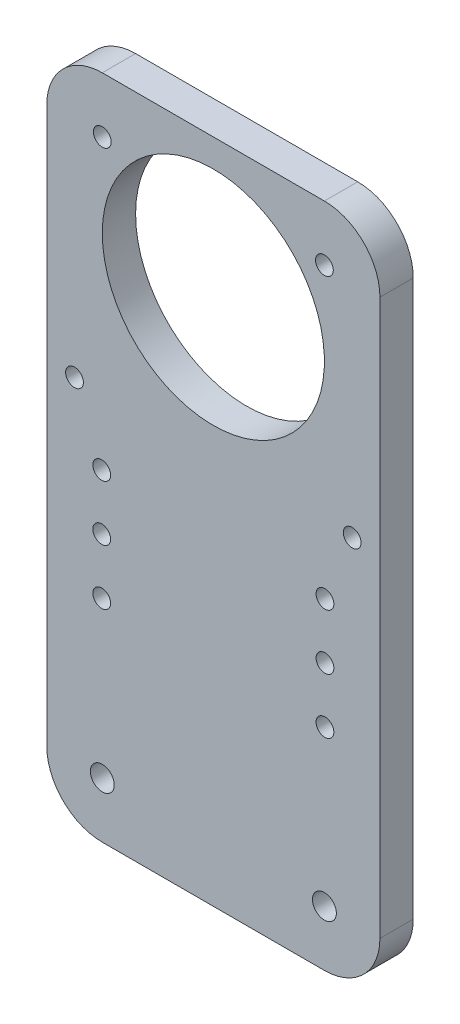
ISO-10303-21;
HEADER;
FILE_DESCRIPTION(('STEP AP214'),'2;1');
FILE_NAME('part.step','',(''),(''),'','','');
FILE_SCHEMA(('AUTOMOTIVE_DESIGN { 1 0 10303 214 1 1 1 1 }'));
ENDSEC;
DATA;
#1=APPLICATION_CONTEXT('core data for automotive mechanical design processes');
#2=APPLICATION_PROTOCOL_DEFINITION('international standard','automotive_design',2000,#1);
#3=PRODUCT_CONTEXT('',#1,'mechanical');
#4=PRODUCT('Part','Part','',(#3));
#5=PRODUCT_RELATED_PRODUCT_CATEGORY('part','',(#4));
#6=PRODUCT_DEFINITION_FORMATION('','',#4);
#7=PRODUCT_DEFINITION_CONTEXT('part definition',#1,'design');
#8=PRODUCT_DEFINITION('design','',#6,#7);
#9=PRODUCT_DEFINITION_SHAPE('','',#8);
#10=(LENGTH_UNIT() NAMED_UNIT(*) SI_UNIT(.MILLI.,.METRE.));
#11=(NAMED_UNIT(*) PLANE_ANGLE_UNIT() SI_UNIT($,.RADIAN.));
#12=(NAMED_UNIT(*) SI_UNIT($,.STERADIAN.) SOLID_ANGLE_UNIT());
#13=UNCERTAINTY_MEASURE_WITH_UNIT(LENGTH_MEASURE(1.E-05),#10,'distance_accuracy_value','');
#14=(GEOMETRIC_REPRESENTATION_CONTEXT(3) GLOBAL_UNCERTAINTY_ASSIGNED_CONTEXT((#13)) GLOBAL_UNIT_ASSIGNED_CONTEXT((#10,
#11,#12)) REPRESENTATION_CONTEXT('',''));
#15=CARTESIAN_POINT('',(0.,0.,0.));
#16=DIRECTION('',(0.,0.,1.));
#17=DIRECTION('',(1.,0.,0.));
#18=AXIS2_PLACEMENT_3D('',#15,#16,#17);
#19=CARTESIAN_POINT('',(0.,0.,6.));
#20=DIRECTION('',(0.,0.,1.));
#21=DIRECTION('',(1.,0.,0.));
#22=AXIS2_PLACEMENT_3D('',#19,#20,#21);
#23=PLANE('',#22);
#24=CARTESIAN_POINT('',(-20.,50.0000000000002,6.));
#25=DIRECTION('',(0.,0.,1.));
#26=DIRECTION('',(1.,0.,0.));
#27=AXIS2_PLACEMENT_3D('',#24,#25,#26);
#28=CIRCLE('',#27,1.6);
#29=CARTESIAN_POINT('',(-18.4,50.0000000000002,6.));
#30=VERTEX_POINT('',#29);
#31=EDGE_CURVE('E297',#30,#30,#28,.F.);
#32=ORIENTED_EDGE('',*,*,#31,.T.);
#33=EDGE_LOOP('',(#32));
#34=FACE_BOUND('',#33,.T.);
#35=CARTESIAN_POINT('',(20.,50.,6.));
#36=DIRECTION('',(0.,0.,1.));
#37=DIRECTION('',(1.,0.,0.));
#38=AXIS2_PLACEMENT_3D('',#35,#36,#37);
#39=CIRCLE('',#38,1.6);
#40=CARTESIAN_POINT('',(21.6,50.,6.));
#41=VERTEX_POINT('',#40);
#42=EDGE_CURVE('E301',#41,#41,#39,.T.);
#43=ORIENTED_EDGE('',*,*,#42,.F.);
#44=EDGE_LOOP('',(#43));
#45=FACE_BOUND('',#44,.T.);
#46=CARTESIAN_POINT('',(0.,35.,6.));
#47=DIRECTION('',(0.,0.,-1.));
#48=DIRECTION('',(-1.,0.,0.));
#49=AXIS2_PLACEMENT_3D('',#46,#47,#48);
#50=CIRCLE('',#49,20.);
#51=CARTESIAN_POINT('',(-20.,35.,6.));
#52=VERTEX_POINT('',#51);
#53=EDGE_CURVE('E247',#52,#52,#50,.T.);
#54=ORIENTED_EDGE('',*,*,#53,.T.);
#55=EDGE_LOOP('',(#54));
#56=FACE_BOUND('',#55,.T.);
#57=CARTESIAN_POINT('',(20.1000000000003,-11.9999999999998,6.));
#58=DIRECTION('',(0.,0.,1.));
#59=DIRECTION('',(1.,0.,0.));
#60=AXIS2_PLACEMENT_3D('',#57,#58,#59);
#61=CIRCLE('',#60,1.6);
#62=CARTESIAN_POINT('',(21.7000000000003,-11.9999999999998,6.));
#63=VERTEX_POINT('',#62);
#64=EDGE_CURVE('E271',#63,#63,#61,.F.);
#65=ORIENTED_EDGE('',*,*,#64,.T.);
#66=EDGE_LOOP('',(#65));
#67=FACE_BOUND('',#66,.T.);
#68=CARTESIAN_POINT('',(20.1000000000002,-1.99999999999975,6.));
#69=DIRECTION('',(0.,0.,1.));
#70=DIRECTION('',(1.,0.,0.));
#71=AXIS2_PLACEMENT_3D('',#68,#69,#70);
#72=CIRCLE('',#71,1.6);
#73=CARTESIAN_POINT('',(21.7000000000002,-1.99999999999975,6.));
#74=VERTEX_POINT('',#73);
#75=EDGE_CURVE('E238',#74,#74,#72,.F.);
#76=ORIENTED_EDGE('',*,*,#75,.T.);
#77=EDGE_LOOP('',(#76));
#78=FACE_BOUND('',#77,.T.);
#79=CARTESIAN_POINT('',(20.1000000000004,-21.9999999999998,6.));
#80=DIRECTION('',(0.,0.,1.));
#81=DIRECTION('',(1.,0.,0.));
#82=AXIS2_PLACEMENT_3D('',#79,#80,#81);
#83=CIRCLE('',#82,1.6);
#84=CARTESIAN_POINT('',(21.7000000000004,-21.9999999999998,6.));
#85=VERTEX_POINT('',#84);
#86=EDGE_CURVE('E234',#85,#85,#83,.F.);
#87=ORIENTED_EDGE('',*,*,#86,.T.);
#88=EDGE_LOOP('',(#87));
#89=FACE_BOUND('',#88,.T.);
#90=CARTESIAN_POINT('',(20.,-50.,6.));
#91=DIRECTION('',(0.,0.,1.));
#92=DIRECTION('',(1.,0.,0.));
#93=AXIS2_PLACEMENT_3D('',#90,#91,#92);
#94=CIRCLE('',#93,2.15);
#95=CARTESIAN_POINT('',(22.15,-50.,6.));
#96=VERTEX_POINT('',#95);
#97=EDGE_CURVE('E166',#96,#96,#94,.T.);
#98=ORIENTED_EDGE('',*,*,#97,.F.);
#99=EDGE_LOOP('',(#98));
#100=FACE_BOUND('',#99,.T.);
#101=DIRECTION('',(1.,0.,0.));
#102=VECTOR('',#101,1.);
#103=CARTESIAN_POINT('',(0.,-60.,6.));
#104=LINE('',#103,#102);
#105=CARTESIAN_POINT('',(-20.,-60.,6.));
#106=VERTEX_POINT('',#105);
#107=CARTESIAN_POINT('',(20.,-60.,6.));
#108=VERTEX_POINT('',#107);
#109=EDGE_CURVE('E221',#106,#108,#104,.T.);
#110=ORIENTED_EDGE('',*,*,#109,.T.);
#111=CARTESIAN_POINT('',(20.,-50.,6.));
#112=DIRECTION('',(0.,0.,1.));
#113=DIRECTION('',(1.,0.,0.));
#114=AXIS2_PLACEMENT_3D('',#111,#112,#113);
#115=CIRCLE('',#114,10.);
#116=CARTESIAN_POINT('',(30.,-50.,6.));
#117=VERTEX_POINT('',#116);
#118=EDGE_CURVE('E189',#108,#117,#115,.T.);
#119=ORIENTED_EDGE('',*,*,#118,.T.);
#120=DIRECTION('',(0.,1.,0.));
#121=VECTOR('',#120,1.);
#122=CARTESIAN_POINT('',(30.,0.,6.));
#123=LINE('',#122,#121);
#124=CARTESIAN_POINT('',(30.,50.,6.));
#125=VERTEX_POINT('',#124);
#126=EDGE_CURVE('E134',#117,#125,#123,.T.);
#127=ORIENTED_EDGE('',*,*,#126,.T.);
#128=CARTESIAN_POINT('',(20.,50.,6.));
#129=DIRECTION('',(0.,0.,1.));
#130=DIRECTION('',(1.,0.,0.));
#131=AXIS2_PLACEMENT_3D('',#128,#129,#130);
#132=CIRCLE('',#131,10.);
#133=CARTESIAN_POINT('',(20.,60.,6.));
#134=VERTEX_POINT('',#133);
#135=EDGE_CURVE('E183',#125,#134,#132,.T.);
#136=ORIENTED_EDGE('',*,*,#135,.T.);
#137=DIRECTION('',(1.,0.,0.));
#138=VECTOR('',#137,1.);
#139=CARTESIAN_POINT('',(0.,60.,6.));
#140=LINE('',#139,#138);
#141=CARTESIAN_POINT('',(-20.,60.,6.));
#142=VERTEX_POINT('',#141);
#143=EDGE_CURVE('E203',#142,#134,#140,.T.);
#144=ORIENTED_EDGE('',*,*,#143,.F.);
#145=CARTESIAN_POINT('',(-20.,50.,6.));
#146=DIRECTION('',(0.,0.,1.));
#147=DIRECTION('',(1.,0.,0.));
#148=AXIS2_PLACEMENT_3D('',#145,#146,#147);
#149=CIRCLE('',#148,10.);
#150=CARTESIAN_POINT('',(-30.,50.,6.));
#151=VERTEX_POINT('',#150);
#152=EDGE_CURVE('E61',#142,#151,#149,.T.);
#153=ORIENTED_EDGE('',*,*,#152,.T.);
#154=DIRECTION('',(0.,1.,0.));
#155=VECTOR('',#154,1.);
#156=CARTESIAN_POINT('',(-30.,0.,6.));
#157=LINE('',#156,#155);
#158=CARTESIAN_POINT('',(-30.,-50.,6.));
#159=VERTEX_POINT('',#158);
#160=EDGE_CURVE('E210',#159,#151,#157,.T.);
#161=ORIENTED_EDGE('',*,*,#160,.F.);
#162=CARTESIAN_POINT('',(-20.,-50.,6.));
#163=DIRECTION('',(0.,0.,1.));
#164=DIRECTION('',(1.,0.,0.));
#165=AXIS2_PLACEMENT_3D('',#162,#163,#164);
#166=CIRCLE('',#165,10.);
#167=EDGE_CURVE('E186',#159,#106,#166,.T.);
#168=ORIENTED_EDGE('',*,*,#167,.T.);
#169=EDGE_LOOP('',(#110,#119,#127,#136,#144,#153,#161,#168));
#170=FACE_BOUND('',#169,.T.);
#171=CARTESIAN_POINT('',(-20.,-50.,6.));
#172=DIRECTION('',(0.,0.,1.));
#173=DIRECTION('',(1.,0.,0.));
#174=AXIS2_PLACEMENT_3D('',#171,#172,#173);
#175=CIRCLE('',#174,2.15);
#176=CARTESIAN_POINT('',(-17.85,-50.,6.));
#177=VERTEX_POINT('',#176);
#178=EDGE_CURVE('E168',#177,#177,#175,.F.);
#179=ORIENTED_EDGE('',*,*,#178,.T.);
#180=EDGE_LOOP('',(#179));
#181=FACE_BOUND('',#180,.T.);
#182=CARTESIAN_POINT('',(-20.1,-1.99999999999997,6.));
#183=DIRECTION('',(0.,0.,1.));
#184=DIRECTION('',(1.,0.,0.));
#185=AXIS2_PLACEMENT_3D('',#182,#183,#184);
#186=CIRCLE('',#185,1.6);
#187=CARTESIAN_POINT('',(-18.5,-1.99999999999997,6.));
#188=VERTEX_POINT('',#187);
#189=EDGE_CURVE('E263',#188,#188,#186,.T.);
#190=ORIENTED_EDGE('',*,*,#189,.F.);
#191=EDGE_LOOP('',(#190));
#192=FACE_BOUND('',#191,.T.);
#193=CARTESIAN_POINT('',(-20.1,-12.,6.));
#194=DIRECTION('',(0.,0.,1.));
#195=DIRECTION('',(1.,0.,0.));
#196=AXIS2_PLACEMENT_3D('',#193,#194,#195);
#197=CIRCLE('',#196,1.6);
#198=CARTESIAN_POINT('',(-18.5,-12.,6.));
#199=VERTEX_POINT('',#198);
#200=EDGE_CURVE('E255',#199,#199,#197,.T.);
#201=ORIENTED_EDGE('',*,*,#200,.F.);
#202=EDGE_LOOP('',(#201));
#203=FACE_BOUND('',#202,.T.);
#204=CARTESIAN_POINT('',(-20.0999999999999,-22.,6.));
#205=DIRECTION('',(0.,0.,1.));
#206=DIRECTION('',(1.,0.,0.));
#207=AXIS2_PLACEMENT_3D('',#204,#205,#206);
#208=CIRCLE('',#207,1.6);
#209=CARTESIAN_POINT('',(-18.4999999999999,-22.,6.));
#210=VERTEX_POINT('',#209);
#211=EDGE_CURVE('E246',#210,#210,#208,.T.);
#212=ORIENTED_EDGE('',*,*,#211,.F.);
#213=EDGE_LOOP('',(#212));
#214=FACE_BOUND('',#213,.T.);
#215=CARTESIAN_POINT('',(-25.0000000000001,10.,6.));
#216=DIRECTION('',(0.,0.,1.));
#217=DIRECTION('',(1.,0.,0.));
#218=AXIS2_PLACEMENT_3D('',#215,#216,#217);
#219=CIRCLE('',#218,1.6);
#220=CARTESIAN_POINT('',(-23.4000000000001,10.,6.));
#221=VERTEX_POINT('',#220);
#222=EDGE_CURVE('E293',#221,#221,#219,.T.);
#223=ORIENTED_EDGE('',*,*,#222,.F.);
#224=EDGE_LOOP('',(#223));
#225=FACE_BOUND('',#224,.T.);
#226=CARTESIAN_POINT('',(24.9999999999999,9.99999999999973,6.));
#227=DIRECTION('',(0.,0.,1.));
#228=DIRECTION('',(1.,0.,0.));
#229=AXIS2_PLACEMENT_3D('',#226,#227,#228);
#230=CIRCLE('',#229,1.6);
#231=CARTESIAN_POINT('',(26.5999999999999,9.99999999999973,6.));
#232=VERTEX_POINT('',#231);
#233=EDGE_CURVE('E286',#232,#232,#230,.F.);
#234=ORIENTED_EDGE('',*,*,#233,.T.);
#235=EDGE_LOOP('',(#234));
#236=FACE_BOUND('',#235,.T.);
#237=ADVANCED_FACE('F45',(#34,#45,#56,#67,#78,#89,#100,#170,#181,#192,#203,#214,#225,#236),#23,.T.);
#238=CARTESIAN_POINT('',(0.,0.,0.));
#239=DIRECTION('',(0.,0.,1.));
#240=DIRECTION('',(1.,0.,0.));
#241=AXIS2_PLACEMENT_3D('',#238,#239,#240);
#242=PLANE('',#241);
#243=CARTESIAN_POINT('',(-25.0000000000001,10.,0.));
#244=DIRECTION('',(0.,0.,-1.));
#245=DIRECTION('',(-1.,0.,0.));
#246=AXIS2_PLACEMENT_3D('',#243,#244,#245);
#247=CIRCLE('',#246,1.6);
#248=CARTESIAN_POINT('',(-26.6000000000001,10.,0.));
#249=VERTEX_POINT('',#248);
#250=EDGE_CURVE('E314',#249,#249,#247,.T.);
#251=ORIENTED_EDGE('',*,*,#250,.F.);
#252=EDGE_LOOP('',(#251));
#253=FACE_BOUND('',#252,.T.);
#254=CARTESIAN_POINT('',(20.,50.,0.));
#255=DIRECTION('',(0.,0.,-1.));
#256=DIRECTION('',(-1.,0.,0.));
#257=AXIS2_PLACEMENT_3D('',#254,#255,#256);
#258=CIRCLE('',#257,1.6);
#259=CARTESIAN_POINT('',(18.4,50.,0.));
#260=VERTEX_POINT('',#259);
#261=EDGE_CURVE('E306',#260,#260,#258,.T.);
#262=ORIENTED_EDGE('',*,*,#261,.F.);
#263=EDGE_LOOP('',(#262));
#264=FACE_BOUND('',#263,.T.);
#265=CARTESIAN_POINT('',(0.,35.,0.));
#266=DIRECTION('',(0.,0.,-1.));
#267=DIRECTION('',(-1.,0.,0.));
#268=AXIS2_PLACEMENT_3D('',#265,#266,#267);
#269=CIRCLE('',#268,20.);
#270=CARTESIAN_POINT('',(-20.,35.,0.));
#271=VERTEX_POINT('',#270);
#272=EDGE_CURVE('E282',#271,#271,#269,.T.);
#273=ORIENTED_EDGE('',*,*,#272,.F.);
#274=EDGE_LOOP('',(#273));
#275=FACE_BOUND('',#274,.T.);
#276=CARTESIAN_POINT('',(-20.1,-12.,0.));
#277=DIRECTION('',(0.,0.,1.));
#278=DIRECTION('',(1.,0.,0.));
#279=AXIS2_PLACEMENT_3D('',#276,#277,#278);
#280=CIRCLE('',#279,1.6);
#281=CARTESIAN_POINT('',(-18.5,-12.,0.));
#282=VERTEX_POINT('',#281);
#283=EDGE_CURVE('E251',#282,#282,#280,.T.);
#284=ORIENTED_EDGE('',*,*,#283,.T.);
#285=EDGE_LOOP('',(#284));
#286=FACE_BOUND('',#285,.T.);
#287=CARTESIAN_POINT('',(-20.,-50.,0.));
#288=DIRECTION('',(0.,0.,1.));
#289=DIRECTION('',(1.,0.,0.));
#290=AXIS2_PLACEMENT_3D('',#287,#288,#289);
#291=CIRCLE('',#290,2.15);
#292=CARTESIAN_POINT('',(-17.85,-50.,0.));
#293=VERTEX_POINT('',#292);
#294=EDGE_CURVE('E162',#293,#293,#291,.F.);
#295=ORIENTED_EDGE('',*,*,#294,.F.);
#296=EDGE_LOOP('',(#295));
#297=FACE_BOUND('',#296,.T.);
#298=DIRECTION('',(0.,1.,0.));
#299=VECTOR('',#298,1.);
#300=CARTESIAN_POINT('',(30.,0.,0.));
#301=LINE('',#300,#299);
#302=CARTESIAN_POINT('',(30.,-50.,0.));
#303=VERTEX_POINT('',#302);
#304=CARTESIAN_POINT('',(30.,50.,0.));
#305=VERTEX_POINT('',#304);
#306=EDGE_CURVE('E131',#303,#305,#301,.T.);
#307=ORIENTED_EDGE('',*,*,#306,.F.);
#308=CARTESIAN_POINT('',(20.,-50.,0.));
#309=DIRECTION('',(0.,0.,1.));
#310=DIRECTION('',(1.,0.,0.));
#311=AXIS2_PLACEMENT_3D('',#308,#309,#310);
#312=CIRCLE('',#311,10.);
#313=CARTESIAN_POINT('',(20.,-60.,0.));
#314=VERTEX_POINT('',#313);
#315=EDGE_CURVE('E113',#303,#314,#312,.F.);
#316=ORIENTED_EDGE('',*,*,#315,.T.);
#317=DIRECTION('',(1.,0.,0.));
#318=VECTOR('',#317,1.);
#319=CARTESIAN_POINT('',(0.,-60.,0.));
#320=LINE('',#319,#318);
#321=CARTESIAN_POINT('',(-20.,-60.,0.));
#322=VERTEX_POINT('',#321);
#323=EDGE_CURVE('E159',#322,#314,#320,.T.);
#324=ORIENTED_EDGE('',*,*,#323,.F.);
#325=CARTESIAN_POINT('',(-20.,-50.,0.));
#326=DIRECTION('',(0.,0.,1.));
#327=DIRECTION('',(1.,0.,0.));
#328=AXIS2_PLACEMENT_3D('',#325,#326,#327);
#329=CIRCLE('',#328,10.);
#330=CARTESIAN_POINT('',(-30.,-50.,0.));
#331=VERTEX_POINT('',#330);
#332=EDGE_CURVE('E125',#322,#331,#329,.F.);
#333=ORIENTED_EDGE('',*,*,#332,.T.);
#334=DIRECTION('',(0.,1.,0.));
#335=VECTOR('',#334,1.);
#336=CARTESIAN_POINT('',(-30.,0.,0.));
#337=LINE('',#336,#335);
#338=CARTESIAN_POINT('',(-30.,50.,0.));
#339=VERTEX_POINT('',#338);
#340=EDGE_CURVE('E149',#331,#339,#337,.T.);
#341=ORIENTED_EDGE('',*,*,#340,.T.);
#342=CARTESIAN_POINT('',(-20.,50.,0.));
#343=DIRECTION('',(0.,0.,1.));
#344=DIRECTION('',(1.,0.,0.));
#345=AXIS2_PLACEMENT_3D('',#342,#343,#344);
#346=CIRCLE('',#345,10.);
#347=CARTESIAN_POINT('',(-20.,60.,0.));
#348=VERTEX_POINT('',#347);
#349=EDGE_CURVE('E136',#339,#348,#346,.F.);
#350=ORIENTED_EDGE('',*,*,#349,.T.);
#351=DIRECTION('',(1.,0.,0.));
#352=VECTOR('',#351,1.);
#353=CARTESIAN_POINT('',(0.,60.,0.));
#354=LINE('',#353,#352);
#355=CARTESIAN_POINT('',(20.,60.,0.));
#356=VERTEX_POINT('',#355);
#357=EDGE_CURVE('E144',#348,#356,#354,.T.);
#358=ORIENTED_EDGE('',*,*,#357,.T.);
#359=CARTESIAN_POINT('',(20.,50.,0.));
#360=DIRECTION('',(0.,0.,1.));
#361=DIRECTION('',(1.,0.,0.));
#362=AXIS2_PLACEMENT_3D('',#359,#360,#361);
#363=CIRCLE('',#362,10.);
#364=EDGE_CURVE('E142',#356,#305,#363,.F.);
#365=ORIENTED_EDGE('',*,*,#364,.T.);
#366=EDGE_LOOP('',(#307,#316,#324,#333,#341,#350,#358,#365));
#367=FACE_BOUND('',#366,.T.);
#368=CARTESIAN_POINT('',(20.,-50.,0.));
#369=DIRECTION('',(0.,0.,1.));
#370=DIRECTION('',(1.,0.,0.));
#371=AXIS2_PLACEMENT_3D('',#368,#369,#370);
#372=CIRCLE('',#371,2.15);
#373=CARTESIAN_POINT('',(22.15,-50.,0.));
#374=VERTEX_POINT('',#373);
#375=EDGE_CURVE('E145',#374,#374,#372,.T.);
#376=ORIENTED_EDGE('',*,*,#375,.T.);
#377=EDGE_LOOP('',(#376));
#378=FACE_BOUND('',#377,.T.);
#379=CARTESIAN_POINT('',(20.1000000000004,-21.9999999999998,0.));
#380=DIRECTION('',(0.,0.,1.));
#381=DIRECTION('',(1.,0.,0.));
#382=AXIS2_PLACEMENT_3D('',#379,#380,#381);
#383=CIRCLE('',#382,1.6);
#384=CARTESIAN_POINT('',(21.7000000000004,-21.9999999999998,0.));
#385=VERTEX_POINT('',#384);
#386=EDGE_CURVE('E152',#385,#385,#383,.F.);
#387=ORIENTED_EDGE('',*,*,#386,.F.);
#388=EDGE_LOOP('',(#387));
#389=FACE_BOUND('',#388,.T.);
#390=CARTESIAN_POINT('',(20.1000000000002,-1.99999999999975,0.));
#391=DIRECTION('',(0.,0.,1.));
#392=DIRECTION('',(1.,0.,0.));
#393=AXIS2_PLACEMENT_3D('',#390,#391,#392);
#394=CIRCLE('',#393,1.6);
#395=CARTESIAN_POINT('',(21.7000000000002,-1.99999999999975,0.));
#396=VERTEX_POINT('',#395);
#397=EDGE_CURVE('E275',#396,#396,#394,.F.);
#398=ORIENTED_EDGE('',*,*,#397,.F.);
#399=EDGE_LOOP('',(#398));
#400=FACE_BOUND('',#399,.T.);
#401=CARTESIAN_POINT('',(20.1000000000003,-11.9999999999998,0.));
#402=DIRECTION('',(0.,0.,1.));
#403=DIRECTION('',(1.,0.,0.));
#404=AXIS2_PLACEMENT_3D('',#401,#402,#403);
#405=CIRCLE('',#404,1.6);
#406=CARTESIAN_POINT('',(21.7000000000003,-11.9999999999998,0.));
#407=VERTEX_POINT('',#406);
#408=EDGE_CURVE('E267',#407,#407,#405,.F.);
#409=ORIENTED_EDGE('',*,*,#408,.F.);
#410=EDGE_LOOP('',(#409));
#411=FACE_BOUND('',#410,.T.);
#412=CARTESIAN_POINT('',(-20.1,-1.99999999999997,0.));
#413=DIRECTION('',(0.,0.,1.));
#414=DIRECTION('',(1.,0.,0.));
#415=AXIS2_PLACEMENT_3D('',#412,#413,#414);
#416=CIRCLE('',#415,1.6);
#417=CARTESIAN_POINT('',(-18.5,-1.99999999999997,0.));
#418=VERTEX_POINT('',#417);
#419=EDGE_CURVE('E259',#418,#418,#416,.T.);
#420=ORIENTED_EDGE('',*,*,#419,.T.);
#421=EDGE_LOOP('',(#420));
#422=FACE_BOUND('',#421,.T.);
#423=CARTESIAN_POINT('',(-20.0999999999999,-22.,0.));
#424=DIRECTION('',(0.,0.,1.));
#425=DIRECTION('',(1.,0.,0.));
#426=AXIS2_PLACEMENT_3D('',#423,#424,#425);
#427=CIRCLE('',#426,1.6);
#428=CARTESIAN_POINT('',(-18.4999999999999,-22.,0.));
#429=VERTEX_POINT('',#428);
#430=EDGE_CURVE('E242',#429,#429,#427,.T.);
#431=ORIENTED_EDGE('',*,*,#430,.T.);
#432=EDGE_LOOP('',(#431));
#433=FACE_BOUND('',#432,.T.);
#434=CARTESIAN_POINT('',(-20.,50.0000000000002,0.));
#435=DIRECTION('',(0.,0.,1.));
#436=DIRECTION('',(1.,0.,0.));
#437=AXIS2_PLACEMENT_3D('',#434,#435,#436);
#438=CIRCLE('',#437,1.6);
#439=CARTESIAN_POINT('',(-18.4,50.0000000000002,0.));
#440=VERTEX_POINT('',#439);
#441=EDGE_CURVE('E310',#440,#440,#438,.T.);
#442=ORIENTED_EDGE('',*,*,#441,.T.);
#443=EDGE_LOOP('',(#442));
#444=FACE_BOUND('',#443,.T.);
#445=CARTESIAN_POINT('',(24.9999999999999,9.99999999999973,0.));
#446=DIRECTION('',(0.,0.,1.));
#447=DIRECTION('',(1.,0.,0.));
#448=AXIS2_PLACEMENT_3D('',#445,#446,#447);
#449=CIRCLE('',#448,1.6);
#450=CARTESIAN_POINT('',(26.5999999999999,9.99999999999973,0.));
#451=VERTEX_POINT('',#450);
#452=EDGE_CURVE('E305',#451,#451,#449,.T.);
#453=ORIENTED_EDGE('',*,*,#452,.T.);
#454=EDGE_LOOP('',(#453));
#455=FACE_BOUND('',#454,.T.);
#456=ADVANCED_FACE('F139',(#253,#264,#275,#286,#297,#367,#378,#389,#400,#411,#422,#433,#444,
#455),#242,.F.);
#457=CARTESIAN_POINT('',(30.,0.,6.));
#458=DIRECTION('',(-1.,0.,0.));
#459=DIRECTION('',(0.,-1.,0.));
#460=AXIS2_PLACEMENT_3D('',#457,#458,#459);
#461=PLANE('',#460);
#462=ORIENTED_EDGE('',*,*,#126,.F.);
#463=DIRECTION('',(0.,0.,-1.));
#464=VECTOR('',#463,1.);
#465=CARTESIAN_POINT('',(30.,-50.,6.));
#466=LINE('',#465,#464);
#467=EDGE_CURVE('E117',#117,#303,#466,.T.);
#468=ORIENTED_EDGE('',*,*,#467,.T.);
#469=ORIENTED_EDGE('',*,*,#306,.T.);
#470=DIRECTION('',(0.,0.,-1.));
#471=VECTOR('',#470,1.);
#472=CARTESIAN_POINT('',(30.,50.,6.));
#473=LINE('',#472,#471);
#474=EDGE_CURVE('E137',#305,#125,#473,.F.);
#475=ORIENTED_EDGE('',*,*,#474,.T.);
#476=EDGE_LOOP('',(#462,#468,#469,#475));
#477=FACE_BOUND('',#476,.T.);
#478=ADVANCED_FACE('F130',(#477),#461,.F.);
#479=CARTESIAN_POINT('',(0.,60.,6.));
#480=DIRECTION('',(0.,1.,0.));
#481=DIRECTION('',(-1.,0.,0.));
#482=AXIS2_PLACEMENT_3D('',#479,#480,#481);
#483=PLANE('',#482);
#484=ORIENTED_EDGE('',*,*,#143,.T.);
#485=DIRECTION('',(0.,0.,-1.));
#486=VECTOR('',#485,1.);
#487=CARTESIAN_POINT('',(20.,60.,0.));
#488=LINE('',#487,#486);
#489=EDGE_CURVE('E11',#134,#356,#488,.T.);
#490=ORIENTED_EDGE('',*,*,#489,.T.);
#491=ORIENTED_EDGE('',*,*,#357,.F.);
#492=DIRECTION('',(0.,0.,-1.));
#493=VECTOR('',#492,1.);
#494=CARTESIAN_POINT('',(-20.,60.,6.));
#495=LINE('',#494,#493);
#496=EDGE_CURVE('E54',#348,#142,#495,.F.);
#497=ORIENTED_EDGE('',*,*,#496,.T.);
#498=EDGE_LOOP('',(#484,#490,#491,#497));
#499=FACE_BOUND('',#498,.T.);
#500=ADVANCED_FACE('F202',(#499),#483,.T.);
#501=CARTESIAN_POINT('',(-30.,0.,6.));
#502=DIRECTION('',(-1.,0.,0.));
#503=DIRECTION('',(0.,-1.,0.));
#504=AXIS2_PLACEMENT_3D('',#501,#502,#503);
#505=PLANE('',#504);
#506=ORIENTED_EDGE('',*,*,#340,.F.);
#507=DIRECTION('',(0.,0.,-1.));
#508=VECTOR('',#507,1.);
#509=CARTESIAN_POINT('',(-30.,-50.,6.));
#510=LINE('',#509,#508);
#511=EDGE_CURVE('E68',#331,#159,#510,.F.);
#512=ORIENTED_EDGE('',*,*,#511,.T.);
#513=ORIENTED_EDGE('',*,*,#160,.T.);
#514=DIRECTION('',(0.,0.,-1.));
#515=VECTOR('',#514,1.);
#516=CARTESIAN_POINT('',(-30.,50.,6.));
#517=LINE('',#516,#515);
#518=EDGE_CURVE('E192',#151,#339,#517,.T.);
#519=ORIENTED_EDGE('',*,*,#518,.T.);
#520=EDGE_LOOP('',(#506,#512,#513,#519));
#521=FACE_BOUND('',#520,.T.);
#522=ADVANCED_FACE('F213',(#521),#505,.T.);
#523=CARTESIAN_POINT('',(0.,-60.,6.));
#524=DIRECTION('',(0.,1.,0.));
#525=DIRECTION('',(0.,0.,1.));
#526=AXIS2_PLACEMENT_3D('',#523,#524,#525);
#527=PLANE('',#526);
#528=ORIENTED_EDGE('',*,*,#323,.T.);
#529=DIRECTION('',(0.,0.,-1.));
#530=VECTOR('',#529,1.);
#531=CARTESIAN_POINT('',(20.,-60.,6.));
#532=LINE('',#531,#530);
#533=EDGE_CURVE('E118',#314,#108,#532,.F.);
#534=ORIENTED_EDGE('',*,*,#533,.T.);
#535=ORIENTED_EDGE('',*,*,#109,.F.);
#536=DIRECTION('',(0.,0.,-1.));
#537=VECTOR('',#536,1.);
#538=CARTESIAN_POINT('',(-20.,-60.,0.));
#539=LINE('',#538,#537);
#540=EDGE_CURVE('E124',#106,#322,#539,.T.);
#541=ORIENTED_EDGE('',*,*,#540,.T.);
#542=EDGE_LOOP('',(#528,#534,#535,#541));
#543=FACE_BOUND('',#542,.T.);
#544=ADVANCED_FACE('F220',(#543),#527,.F.);
#545=CARTESIAN_POINT('',(20.,-50.,6.));
#546=DIRECTION('',(0.,0.,-1.));
#547=DIRECTION('',(-1.,0.,0.));
#548=AXIS2_PLACEMENT_3D('',#545,#546,#547);
#549=CYLINDRICAL_SURFACE('',#548,2.15);
#550=ORIENTED_EDGE('',*,*,#97,.T.);
#551=EDGE_LOOP('',(#550));
#552=FACE_BOUND('',#551,.T.);
#553=ORIENTED_EDGE('',*,*,#375,.F.);
#554=EDGE_LOOP('',(#553));
#555=FACE_BOUND('',#554,.T.);
#556=ADVANCED_FACE('F352',(#552,#555),#549,.F.);
#557=CARTESIAN_POINT('',(-20.,-50.,6.));
#558=DIRECTION('',(0.,0.,-1.));
#559=DIRECTION('',(-1.,0.,0.));
#560=AXIS2_PLACEMENT_3D('',#557,#558,#559);
#561=CYLINDRICAL_SURFACE('',#560,2.15);
#562=ORIENTED_EDGE('',*,*,#178,.F.);
#563=EDGE_LOOP('',(#562));
#564=FACE_BOUND('',#563,.T.);
#565=ORIENTED_EDGE('',*,*,#294,.T.);
#566=EDGE_LOOP('',(#565));
#567=FACE_BOUND('',#566,.T.);
#568=ADVANCED_FACE('F349',(#564,#567),#561,.F.);
#569=CARTESIAN_POINT('',(20.1000000000004,-21.9999999999998,0.));
#570=DIRECTION('',(0.,0.,1.));
#571=DIRECTION('',(1.,0.,0.));
#572=AXIS2_PLACEMENT_3D('',#569,#570,#571);
#573=CYLINDRICAL_SURFACE('',#572,1.6);
#574=ORIENTED_EDGE('',*,*,#386,.T.);
#575=EDGE_LOOP('',(#574));
#576=FACE_BOUND('',#575,.T.);
#577=ORIENTED_EDGE('',*,*,#86,.F.);
#578=EDGE_LOOP('',(#577));
#579=FACE_BOUND('',#578,.T.);
#580=ADVANCED_FACE('F346',(#576,#579),#573,.F.);
#581=CARTESIAN_POINT('',(20.1000000000002,-1.99999999999975,0.));
#582=DIRECTION('',(0.,0.,1.));
#583=DIRECTION('',(1.,0.,0.));
#584=AXIS2_PLACEMENT_3D('',#581,#582,#583);
#585=CYLINDRICAL_SURFACE('',#584,1.6);
#586=ORIENTED_EDGE('',*,*,#397,.T.);
#587=EDGE_LOOP('',(#586));
#588=FACE_BOUND('',#587,.T.);
#589=ORIENTED_EDGE('',*,*,#75,.F.);
#590=EDGE_LOOP('',(#589));
#591=FACE_BOUND('',#590,.T.);
#592=ADVANCED_FACE('F390',(#588,#591),#585,.F.);
#593=CARTESIAN_POINT('',(20.1000000000003,-11.9999999999998,0.));
#594=DIRECTION('',(0.,0.,1.));
#595=DIRECTION('',(1.,0.,0.));
#596=AXIS2_PLACEMENT_3D('',#593,#594,#595);
#597=CYLINDRICAL_SURFACE('',#596,1.6);
#598=ORIENTED_EDGE('',*,*,#408,.T.);
#599=EDGE_LOOP('',(#598));
#600=FACE_BOUND('',#599,.T.);
#601=ORIENTED_EDGE('',*,*,#64,.F.);
#602=EDGE_LOOP('',(#601));
#603=FACE_BOUND('',#602,.T.);
#604=ADVANCED_FACE('F393',(#600,#603),#597,.F.);
#605=CARTESIAN_POINT('',(-20.1,-1.99999999999997,0.));
#606=DIRECTION('',(0.,0.,1.));
#607=DIRECTION('',(1.,0.,0.));
#608=AXIS2_PLACEMENT_3D('',#605,#606,#607);
#609=CYLINDRICAL_SURFACE('',#608,1.6);
#610=ORIENTED_EDGE('',*,*,#419,.F.);
#611=EDGE_LOOP('',(#610));
#612=FACE_BOUND('',#611,.T.);
#613=ORIENTED_EDGE('',*,*,#189,.T.);
#614=EDGE_LOOP('',(#613));
#615=FACE_BOUND('',#614,.T.);
#616=ADVANCED_FACE('F397',(#612,#615),#609,.F.);
#617=CARTESIAN_POINT('',(-20.1,-12.,0.));
#618=DIRECTION('',(0.,0.,1.));
#619=DIRECTION('',(1.,0.,0.));
#620=AXIS2_PLACEMENT_3D('',#617,#618,#619);
#621=CYLINDRICAL_SURFACE('',#620,1.6);
#622=ORIENTED_EDGE('',*,*,#283,.F.);
#623=EDGE_LOOP('',(#622));
#624=FACE_BOUND('',#623,.T.);
#625=ORIENTED_EDGE('',*,*,#200,.T.);
#626=EDGE_LOOP('',(#625));
#627=FACE_BOUND('',#626,.T.);
#628=ADVANCED_FACE('F401',(#624,#627),#621,.F.);
#629=CARTESIAN_POINT('',(-20.0999999999999,-22.,0.));
#630=DIRECTION('',(0.,0.,1.));
#631=DIRECTION('',(1.,0.,0.));
#632=AXIS2_PLACEMENT_3D('',#629,#630,#631);
#633=CYLINDRICAL_SURFACE('',#632,1.6);
#634=ORIENTED_EDGE('',*,*,#430,.F.);
#635=EDGE_LOOP('',(#634));
#636=FACE_BOUND('',#635,.T.);
#637=ORIENTED_EDGE('',*,*,#211,.T.);
#638=EDGE_LOOP('',(#637));
#639=FACE_BOUND('',#638,.T.);
#640=ADVANCED_FACE('F367',(#636,#639),#633,.F.);
#641=CARTESIAN_POINT('',(20.,-50.,6.));
#642=DIRECTION('',(0.,0.,-1.));
#643=DIRECTION('',(-1.,0.,0.));
#644=AXIS2_PLACEMENT_3D('',#641,#642,#643);
#645=CYLINDRICAL_SURFACE('',#644,10.);
#646=ORIENTED_EDGE('',*,*,#118,.F.);
#647=ORIENTED_EDGE('',*,*,#533,.F.);
#648=ORIENTED_EDGE('',*,*,#315,.F.);
#649=ORIENTED_EDGE('',*,*,#467,.F.);
#650=EDGE_LOOP('',(#646,#647,#648,#649));
#651=FACE_BOUND('',#650,.T.);
#652=ADVANCED_FACE('F116',(#651),#645,.T.);
#653=CARTESIAN_POINT('',(-20.,-50.,6.));
#654=DIRECTION('',(0.,0.,1.));
#655=DIRECTION('',(1.,0.,0.));
#656=AXIS2_PLACEMENT_3D('',#653,#654,#655);
#657=CYLINDRICAL_SURFACE('',#656,10.);
#658=ORIENTED_EDGE('',*,*,#167,.F.);
#659=ORIENTED_EDGE('',*,*,#511,.F.);
#660=ORIENTED_EDGE('',*,*,#332,.F.);
#661=ORIENTED_EDGE('',*,*,#540,.F.);
#662=EDGE_LOOP('',(#658,#659,#660,#661));
#663=FACE_BOUND('',#662,.T.);
#664=ADVANCED_FACE('F217',(#663),#657,.T.);
#665=CARTESIAN_POINT('',(20.,50.,6.));
#666=DIRECTION('',(0.,0.,1.));
#667=DIRECTION('',(1.,0.,0.));
#668=AXIS2_PLACEMENT_3D('',#665,#666,#667);
#669=CYLINDRICAL_SURFACE('',#668,10.);
#670=ORIENTED_EDGE('',*,*,#135,.F.);
#671=ORIENTED_EDGE('',*,*,#474,.F.);
#672=ORIENTED_EDGE('',*,*,#364,.F.);
#673=ORIENTED_EDGE('',*,*,#489,.F.);
#674=EDGE_LOOP('',(#670,#671,#672,#673));
#675=FACE_BOUND('',#674,.T.);
#676=ADVANCED_FACE('F369',(#675),#669,.T.);
#677=CARTESIAN_POINT('',(-20.,50.,6.));
#678=DIRECTION('',(0.,0.,-1.));
#679=DIRECTION('',(-1.,0.,0.));
#680=AXIS2_PLACEMENT_3D('',#677,#678,#679);
#681=CYLINDRICAL_SURFACE('',#680,10.);
#682=ORIENTED_EDGE('',*,*,#152,.F.);
#683=ORIENTED_EDGE('',*,*,#496,.F.);
#684=ORIENTED_EDGE('',*,*,#349,.F.);
#685=ORIENTED_EDGE('',*,*,#518,.F.);
#686=EDGE_LOOP('',(#682,#683,#684,#685));
#687=FACE_BOUND('',#686,.T.);
#688=ADVANCED_FACE('F47',(#687),#681,.T.);
#689=CARTESIAN_POINT('',(0.,35.,6.));
#690=DIRECTION('',(0.,0.,-1.));
#691=DIRECTION('',(-1.,0.,0.));
#692=AXIS2_PLACEMENT_3D('',#689,#690,#691);
#693=CYLINDRICAL_SURFACE('',#692,20.);
#694=ORIENTED_EDGE('',*,*,#53,.F.);
#695=EDGE_LOOP('',(#694));
#696=FACE_BOUND('',#695,.T.);
#697=ORIENTED_EDGE('',*,*,#272,.T.);
#698=EDGE_LOOP('',(#697));
#699=FACE_BOUND('',#698,.T.);
#700=ADVANCED_FACE('F375',(#696,#699),#693,.F.);
#701=CARTESIAN_POINT('',(20.,50.,10.));
#702=DIRECTION('',(0.,0.,-1.));
#703=DIRECTION('',(-1.,0.,0.));
#704=AXIS2_PLACEMENT_3D('',#701,#702,#703);
#705=CYLINDRICAL_SURFACE('',#704,1.6);
#706=ORIENTED_EDGE('',*,*,#42,.T.);
#707=EDGE_LOOP('',(#706));
#708=FACE_BOUND('',#707,.T.);
#709=ORIENTED_EDGE('',*,*,#261,.T.);
#710=EDGE_LOOP('',(#709));
#711=FACE_BOUND('',#710,.T.);
#712=ADVANCED_FACE('F378',(#708,#711),#705,.F.);
#713=CARTESIAN_POINT('',(-20.,50.0000000000002,10.));
#714=DIRECTION('',(0.,0.,-1.));
#715=DIRECTION('',(-1.,0.,0.));
#716=AXIS2_PLACEMENT_3D('',#713,#714,#715);
#717=CYLINDRICAL_SURFACE('',#716,1.6);
#718=ORIENTED_EDGE('',*,*,#31,.F.);
#719=EDGE_LOOP('',(#718));
#720=FACE_BOUND('',#719,.T.);
#721=ORIENTED_EDGE('',*,*,#441,.F.);
#722=EDGE_LOOP('',(#721));
#723=FACE_BOUND('',#722,.T.);
#724=ADVANCED_FACE('F331',(#720,#723),#717,.F.);
#725=CARTESIAN_POINT('',(-25.0000000000001,10.,10.));
#726=DIRECTION('',(0.,0.,-1.));
#727=DIRECTION('',(-1.,0.,0.));
#728=AXIS2_PLACEMENT_3D('',#725,#726,#727);
#729=CYLINDRICAL_SURFACE('',#728,1.6);
#730=ORIENTED_EDGE('',*,*,#222,.T.);
#731=EDGE_LOOP('',(#730));
#732=FACE_BOUND('',#731,.T.);
#733=ORIENTED_EDGE('',*,*,#250,.T.);
#734=EDGE_LOOP('',(#733));
#735=FACE_BOUND('',#734,.T.);
#736=ADVANCED_FACE('F325',(#732,#735),#729,.F.);
#737=CARTESIAN_POINT('',(24.9999999999999,9.99999999999973,10.));
#738=DIRECTION('',(0.,0.,-1.));
#739=DIRECTION('',(-1.,0.,0.));
#740=AXIS2_PLACEMENT_3D('',#737,#738,#739);
#741=CYLINDRICAL_SURFACE('',#740,1.6);
#742=ORIENTED_EDGE('',*,*,#233,.F.);
#743=EDGE_LOOP('',(#742));
#744=FACE_BOUND('',#743,.T.);
#745=ORIENTED_EDGE('',*,*,#452,.F.);
#746=EDGE_LOOP('',(#745));
#747=FACE_BOUND('',#746,.T.);
#748=ADVANCED_FACE('F323',(#744,#747),#741,.F.);
#749=CLOSED_SHELL('',(#237,#456,#478,#500,#522,#544,#556,#568,#580,#592,#604,#616,#628,#640,
#652,#664,#676,#688,#700,#712,#724,#736,#748));
#750=MANIFOLD_SOLID_BREP('B2',#749);
#751=ADVANCED_BREP_SHAPE_REPRESENTATION('',(#18,#750),#14);
#752=SHAPE_DEFINITION_REPRESENTATION(#9,#751);
ENDSEC;
END-ISO-10303-21;
